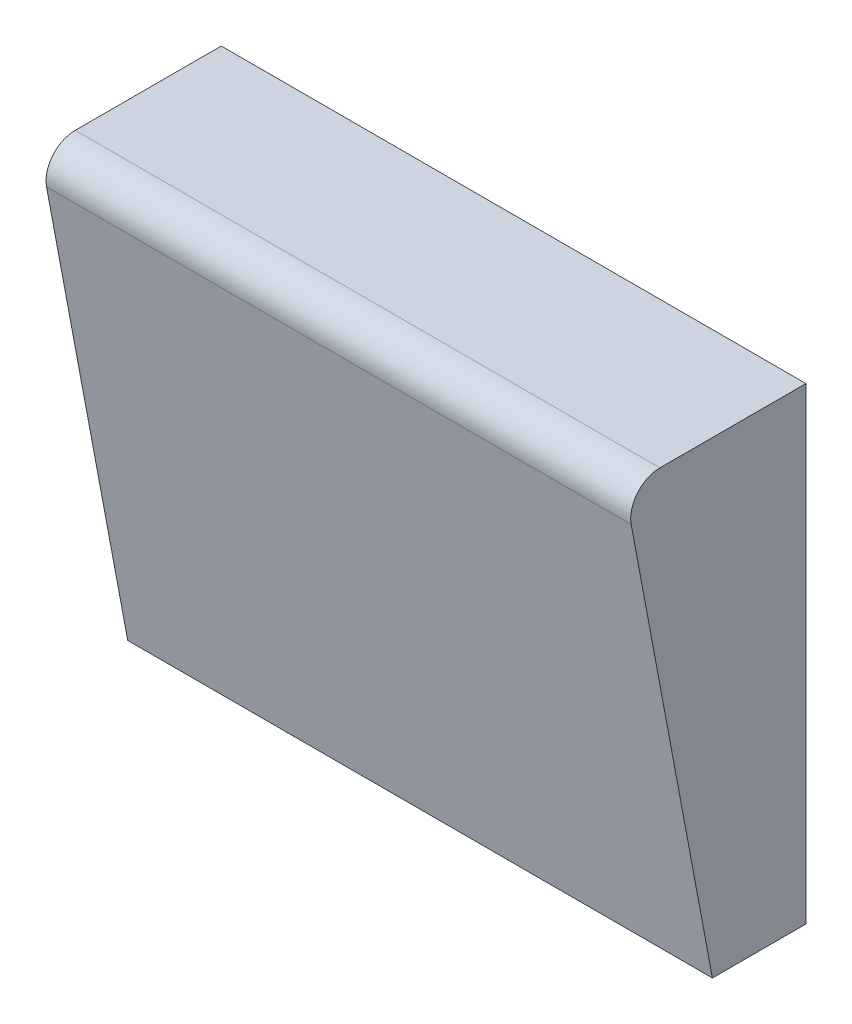
ISO-10303-21;
HEADER;
FILE_DESCRIPTION(('STEP AP214'),'2;1');
FILE_NAME('part.step','',(''),(''),'','','');
FILE_SCHEMA(('AUTOMOTIVE_DESIGN { 1 0 10303 214 1 1 1 1 }'));
ENDSEC;
DATA;
#1=APPLICATION_CONTEXT('core data for automotive mechanical design processes');
#2=APPLICATION_PROTOCOL_DEFINITION('international standard','automotive_design',2000,#1);
#3=PRODUCT_CONTEXT('',#1,'mechanical');
#4=PRODUCT('Part','Part','',(#3));
#5=PRODUCT_RELATED_PRODUCT_CATEGORY('part','',(#4));
#6=PRODUCT_DEFINITION_FORMATION('','',#4);
#7=PRODUCT_DEFINITION_CONTEXT('part definition',#1,'design');
#8=PRODUCT_DEFINITION('design','',#6,#7);
#9=PRODUCT_DEFINITION_SHAPE('','',#8);
#10=(LENGTH_UNIT() NAMED_UNIT(*) SI_UNIT(.MILLI.,.METRE.));
#11=(NAMED_UNIT(*) PLANE_ANGLE_UNIT() SI_UNIT($,.RADIAN.));
#12=(NAMED_UNIT(*) SI_UNIT($,.STERADIAN.) SOLID_ANGLE_UNIT());
#13=UNCERTAINTY_MEASURE_WITH_UNIT(LENGTH_MEASURE(1.E-05),#10,'distance_accuracy_value','');
#14=(GEOMETRIC_REPRESENTATION_CONTEXT(3) GLOBAL_UNCERTAINTY_ASSIGNED_CONTEXT((#13)) GLOBAL_UNIT_ASSIGNED_CONTEXT((#10,
#11,#12)) REPRESENTATION_CONTEXT('',''));
#15=CARTESIAN_POINT('',(0.,0.,0.));
#16=DIRECTION('',(0.,0.,1.));
#17=DIRECTION('',(1.,0.,0.));
#18=AXIS2_PLACEMENT_3D('',#15,#16,#17);
#19=CARTESIAN_POINT('',(20.,32.02,6.));
#20=DIRECTION('',(0.,0.184177332462415,-0.982893030907753));
#21=DIRECTION('',(0.,0.982893030907753,0.184177332462415));
#22=AXIS2_PLACEMENT_3D('',#19,#20,#21);
#23=PLANE('',#22);
#24=DIRECTION('',(0.,-0.982893030907753,-0.184177332462415));
#25=VECTOR('',#24,1.);
#26=CARTESIAN_POINT('',(0.,32.02,6.));
#27=LINE('',#26,#25);
#28=CARTESIAN_POINT('',(0.,30.8358226675376,5.77810543426688));
#29=VERTEX_POINT('',#28);
#30=CARTESIAN_POINT('',(0.,16.01,3.));
#31=VERTEX_POINT('',#30);
#32=EDGE_CURVE('E107',#29,#31,#27,.T.);
#33=ORIENTED_EDGE('',*,*,#32,.T.);
#34=DIRECTION('',(1.,0.,0.));
#35=VECTOR('',#34,1.);
#36=CARTESIAN_POINT('',(20.,16.01,3.));
#37=LINE('',#36,#35);
#38=CARTESIAN_POINT('',(20.,16.01,3.));
#39=VERTEX_POINT('',#38);
#40=EDGE_CURVE('E50',#31,#39,#37,.T.);
#41=ORIENTED_EDGE('',*,*,#40,.T.);
#42=DIRECTION('',(0.,-0.982893030907753,-0.184177332462415));
#43=VECTOR('',#42,1.);
#44=CARTESIAN_POINT('',(20.,32.02,6.));
#45=LINE('',#44,#43);
#46=CARTESIAN_POINT('',(20.,30.8358226675376,5.77810543426688));
#47=VERTEX_POINT('',#46);
#48=EDGE_CURVE('E94',#47,#39,#45,.T.);
#49=ORIENTED_EDGE('',*,*,#48,.F.);
#50=DIRECTION('',(-1.,0.,0.));
#51=VECTOR('',#50,1.);
#52=CARTESIAN_POINT('',(20.,30.8358226675376,5.77810543426688));
#53=LINE('',#52,#51);
#54=EDGE_CURVE('E117',#47,#29,#53,.T.);
#55=ORIENTED_EDGE('',*,*,#54,.T.);
#56=EDGE_LOOP('',(#33,#41,#49,#55));
#57=FACE_BOUND('',#56,.T.);
#58=ADVANCED_FACE('F35',(#57),#23,.F.);
#59=CARTESIAN_POINT('',(20.,0.,-0.2));
#60=DIRECTION('',(0.,0.,1.));
#61=DIRECTION('',(1.,0.,0.));
#62=AXIS2_PLACEMENT_3D('',#59,#60,#61);
#63=PLANE('',#62);
#64=CARTESIAN_POINT('',(10.,25.,-0.2));
#65=DIRECTION('',(0.,0.,-1.));
#66=DIRECTION('',(-1.,0.,0.));
#67=AXIS2_PLACEMENT_3D('',#64,#65,#66);
#68=CIRCLE('',#67,2.25);
#69=CARTESIAN_POINT('',(7.75,25.,-0.2));
#70=VERTEX_POINT('',#69);
#71=EDGE_CURVE('E219',#70,#70,#68,.T.);
#72=ORIENTED_EDGE('',*,*,#71,.F.);
#73=EDGE_LOOP('',(#72));
#74=FACE_BOUND('',#73,.T.);
#75=DIRECTION('',(0.,1.,0.));
#76=VECTOR('',#75,1.);
#77=CARTESIAN_POINT('',(20.,0.,-0.2));
#78=LINE('',#77,#76);
#79=CARTESIAN_POINT('',(20.,16.01,-0.2));
#80=VERTEX_POINT('',#79);
#81=CARTESIAN_POINT('',(20.,32.02,-0.2));
#82=VERTEX_POINT('',#81);
#83=EDGE_CURVE('E91',#80,#82,#78,.T.);
#84=ORIENTED_EDGE('',*,*,#83,.F.);
#85=DIRECTION('',(-1.,0.,0.));
#86=VECTOR('',#85,1.);
#87=CARTESIAN_POINT('',(20.,16.01,-0.2));
#88=LINE('',#87,#86);
#89=CARTESIAN_POINT('',(0.,16.01,-0.2));
#90=VERTEX_POINT('',#89);
#91=EDGE_CURVE('E80',#80,#90,#88,.T.);
#92=ORIENTED_EDGE('',*,*,#91,.T.);
#93=DIRECTION('',(0.,1.,0.));
#94=VECTOR('',#93,1.);
#95=CARTESIAN_POINT('',(0.,0.,-0.2));
#96=LINE('',#95,#94);
#97=CARTESIAN_POINT('',(0.,32.02,-0.2));
#98=VERTEX_POINT('',#97);
#99=EDGE_CURVE('E110',#90,#98,#96,.T.);
#100=ORIENTED_EDGE('',*,*,#99,.T.);
#101=DIRECTION('',(-1.,0.,0.));
#102=VECTOR('',#101,1.);
#103=CARTESIAN_POINT('',(20.,32.02,-0.2));
#104=LINE('',#103,#102);
#105=EDGE_CURVE('E99',#82,#98,#104,.T.);
#106=ORIENTED_EDGE('',*,*,#105,.F.);
#107=EDGE_LOOP('',(#84,#92,#100,#106));
#108=FACE_BOUND('',#107,.T.);
#109=ADVANCED_FACE('F97',(#74,#108),#63,.F.);
#110=CARTESIAN_POINT('',(20.,32.02,-0.2));
#111=DIRECTION('',(0.,-1.,0.));
#112=DIRECTION('',(0.,0.,-1.));
#113=AXIS2_PLACEMENT_3D('',#110,#111,#112);
#114=PLANE('',#113);
#115=DIRECTION('',(0.,0.,1.));
#116=VECTOR('',#115,1.);
#117=CARTESIAN_POINT('',(0.,32.02,-0.2));
#118=LINE('',#117,#116);
#119=CARTESIAN_POINT('',(0.,32.02,4.79521240335913));
#120=VERTEX_POINT('',#119);
#121=EDGE_CURVE('E103',#98,#120,#118,.T.);
#122=ORIENTED_EDGE('',*,*,#121,.T.);
#123=DIRECTION('',(-1.,0.,0.));
#124=VECTOR('',#123,1.);
#125=CARTESIAN_POINT('',(20.,32.02,4.79521240335913));
#126=LINE('',#125,#124);
#127=CARTESIAN_POINT('',(20.,32.02,4.79521240335913));
#128=VERTEX_POINT('',#127);
#129=EDGE_CURVE('E43',#120,#128,#126,.F.);
#130=ORIENTED_EDGE('',*,*,#129,.T.);
#131=DIRECTION('',(0.,0.,1.));
#132=VECTOR('',#131,1.);
#133=CARTESIAN_POINT('',(20.,32.02,-0.2));
#134=LINE('',#133,#132);
#135=EDGE_CURVE('E100',#82,#128,#134,.T.);
#136=ORIENTED_EDGE('',*,*,#135,.F.);
#137=ORIENTED_EDGE('',*,*,#105,.T.);
#138=EDGE_LOOP('',(#122,#130,#136,#137));
#139=FACE_BOUND('',#138,.T.);
#140=ADVANCED_FACE('F129',(#139),#114,.F.);
#141=CARTESIAN_POINT('',(20.,0.,0.));
#142=DIRECTION('',(1.,0.,0.));
#143=DIRECTION('',(0.,0.,-1.));
#144=AXIS2_PLACEMENT_3D('',#141,#142,#143);
#145=PLANE('',#144);
#146=DIRECTION('',(0.,0.,1.));
#147=VECTOR('',#146,1.);
#148=CARTESIAN_POINT('',(20.,16.01,6.45635954146754));
#149=LINE('',#148,#147);
#150=EDGE_CURVE('E83',#80,#39,#149,.T.);
#151=ORIENTED_EDGE('',*,*,#150,.F.);
#152=ORIENTED_EDGE('',*,*,#83,.T.);
#153=ORIENTED_EDGE('',*,*,#135,.T.);
#154=CARTESIAN_POINT('',(20.,31.02,4.79521240335913));
#155=DIRECTION('',(1.,0.,0.));
#156=DIRECTION('',(0.,0.,-1.));
#157=AXIS2_PLACEMENT_3D('',#154,#155,#156);
#158=CIRCLE('',#157,1.);
#159=EDGE_CURVE('E120',#128,#47,#158,.T.);
#160=ORIENTED_EDGE('',*,*,#159,.T.);
#161=ORIENTED_EDGE('',*,*,#48,.T.);
#162=EDGE_LOOP('',(#151,#152,#153,#160,#161));
#163=FACE_BOUND('',#162,.T.);
#164=ADVANCED_FACE('F90',(#163),#145,.T.);
#165=CARTESIAN_POINT('',(0.,0.,0.));
#166=DIRECTION('',(1.,0.,0.));
#167=DIRECTION('',(0.,0.,-1.));
#168=AXIS2_PLACEMENT_3D('',#165,#166,#167);
#169=PLANE('',#168);
#170=ORIENTED_EDGE('',*,*,#99,.F.);
#171=DIRECTION('',(0.,0.,1.));
#172=VECTOR('',#171,1.);
#173=CARTESIAN_POINT('',(0.,16.01,0.));
#174=LINE('',#173,#172);
#175=EDGE_CURVE('E11',#90,#31,#174,.T.);
#176=ORIENTED_EDGE('',*,*,#175,.T.);
#177=ORIENTED_EDGE('',*,*,#32,.F.);
#178=CARTESIAN_POINT('',(0.,31.02,4.79521240335913));
#179=DIRECTION('',(1.,0.,0.));
#180=DIRECTION('',(0.,0.,-1.));
#181=AXIS2_PLACEMENT_3D('',#178,#179,#180);
#182=CIRCLE('',#181,1.);
#183=EDGE_CURVE('E115',#29,#120,#182,.F.);
#184=ORIENTED_EDGE('',*,*,#183,.T.);
#185=ORIENTED_EDGE('',*,*,#121,.F.);
#186=EDGE_LOOP('',(#170,#176,#177,#184,#185));
#187=FACE_BOUND('',#186,.T.);
#188=ADVANCED_FACE('F128',(#187),#169,.F.);
#189=CARTESIAN_POINT('',(10.,25.,2.3));
#190=DIRECTION('',(0.,0.,-1.));
#191=DIRECTION('',(-1.,0.,0.));
#192=AXIS2_PLACEMENT_3D('',#189,#190,#191);
#193=CYLINDRICAL_SURFACE('',#192,2.25);
#194=CARTESIAN_POINT('',(10.,25.,2.3));
#195=DIRECTION('',(0.,0.,-1.));
#196=DIRECTION('',(-1.,0.,0.));
#197=AXIS2_PLACEMENT_3D('',#194,#195,#196);
#198=CIRCLE('',#197,2.25);
#199=CARTESIAN_POINT('',(7.75,25.,2.3));
#200=VERTEX_POINT('',#199);
#201=EDGE_CURVE('E111',#200,#200,#198,.T.);
#202=ORIENTED_EDGE('',*,*,#201,.F.);
#203=EDGE_LOOP('',(#202));
#204=FACE_BOUND('',#203,.T.);
#205=ORIENTED_EDGE('',*,*,#71,.T.);
#206=EDGE_LOOP('',(#205));
#207=FACE_BOUND('',#206,.T.);
#208=ADVANCED_FACE('F164',(#204,#207),#193,.F.);
#209=CARTESIAN_POINT('',(10.,25.,2.3));
#210=DIRECTION('',(0.,0.,-1.));
#211=DIRECTION('',(-1.,0.,0.));
#212=AXIS2_PLACEMENT_3D('',#209,#210,#211);
#213=PLANE('',#212);
#214=CARTESIAN_POINT('',(10.,25.,2.3));
#215=DIRECTION('',(0.,0.,-1.));
#216=DIRECTION('',(-1.,0.,0.));
#217=AXIS2_PLACEMENT_3D('',#214,#215,#216);
#218=CIRCLE('',#217,1.5);
#219=CARTESIAN_POINT('',(8.5,25.,2.3));
#220=VERTEX_POINT('',#219);
#221=EDGE_CURVE('E223',#220,#220,#218,.T.);
#222=ORIENTED_EDGE('',*,*,#221,.F.);
#223=EDGE_LOOP('',(#222));
#224=FACE_BOUND('',#223,.T.);
#225=ORIENTED_EDGE('',*,*,#201,.T.);
#226=EDGE_LOOP('',(#225));
#227=FACE_BOUND('',#226,.T.);
#228=ADVANCED_FACE('F183',(#224,#227),#213,.T.);
#229=CARTESIAN_POINT('',(20.,31.02,4.79521240335913));
#230=DIRECTION('',(-1.,0.,0.));
#231=DIRECTION('',(0.,0.,1.));
#232=AXIS2_PLACEMENT_3D('',#229,#230,#231);
#233=CYLINDRICAL_SURFACE('',#232,1.);
#234=ORIENTED_EDGE('',*,*,#159,.F.);
#235=ORIENTED_EDGE('',*,*,#129,.F.);
#236=ORIENTED_EDGE('',*,*,#183,.F.);
#237=ORIENTED_EDGE('',*,*,#54,.F.);
#238=EDGE_LOOP('',(#234,#235,#236,#237));
#239=FACE_BOUND('',#238,.T.);
#240=ADVANCED_FACE('F37',(#239),#233,.T.);
#241=CARTESIAN_POINT('',(-10.,16.01,6.45635954146754));
#242=DIRECTION('',(0.,1.,0.));
#243=DIRECTION('',(0.,0.,1.));
#244=AXIS2_PLACEMENT_3D('',#241,#242,#243);
#245=PLANE('',#244);
#246=ORIENTED_EDGE('',*,*,#175,.F.);
#247=ORIENTED_EDGE('',*,*,#91,.F.);
#248=ORIENTED_EDGE('',*,*,#150,.T.);
#249=ORIENTED_EDGE('',*,*,#40,.F.);
#250=EDGE_LOOP('',(#246,#247,#248,#249));
#251=FACE_BOUND('',#250,.T.);
#252=ADVANCED_FACE('F82',(#251),#245,.F.);
#253=CARTESIAN_POINT('',(10.,25.,4.3));
#254=DIRECTION('',(0.,0.,-1.));
#255=DIRECTION('',(-1.,0.,0.));
#256=AXIS2_PLACEMENT_3D('',#253,#254,#255);
#257=CYLINDRICAL_SURFACE('',#256,1.5);
#258=CARTESIAN_POINT('',(10.,25.,4.3));
#259=DIRECTION('',(0.,0.,-1.));
#260=DIRECTION('',(-1.,0.,0.));
#261=AXIS2_PLACEMENT_3D('',#258,#259,#260);
#262=CIRCLE('',#261,1.5);
#263=CARTESIAN_POINT('',(8.5,25.,4.3));
#264=VERTEX_POINT('',#263);
#265=EDGE_CURVE('E95',#264,#264,#262,.T.);
#266=ORIENTED_EDGE('',*,*,#265,.F.);
#267=EDGE_LOOP('',(#266));
#268=FACE_BOUND('',#267,.T.);
#269=ORIENTED_EDGE('',*,*,#221,.T.);
#270=EDGE_LOOP('',(#269));
#271=FACE_BOUND('',#270,.T.);
#272=ADVANCED_FACE('F174',(#268,#271),#257,.F.);
#273=CARTESIAN_POINT('',(10.,25.,4.3));
#274=DIRECTION('',(0.,0.,-1.));
#275=DIRECTION('',(-1.,0.,0.));
#276=AXIS2_PLACEMENT_3D('',#273,#274,#275);
#277=PLANE('',#276);
#278=ORIENTED_EDGE('',*,*,#265,.T.);
#279=EDGE_LOOP('',(#278));
#280=FACE_BOUND('',#279,.T.);
#281=ADVANCED_FACE('F195',(#280),#277,.T.);
#282=CLOSED_SHELL('',(#58,#109,#140,#164,#188,#208,#228,#240,#252,#272,#281));
#283=MANIFOLD_SOLID_BREP('B2',#282);
#284=ADVANCED_BREP_SHAPE_REPRESENTATION('',(#18,#283),#14);
#285=SHAPE_DEFINITION_REPRESENTATION(#9,#284);
ENDSEC;
END-ISO-10303-21;
